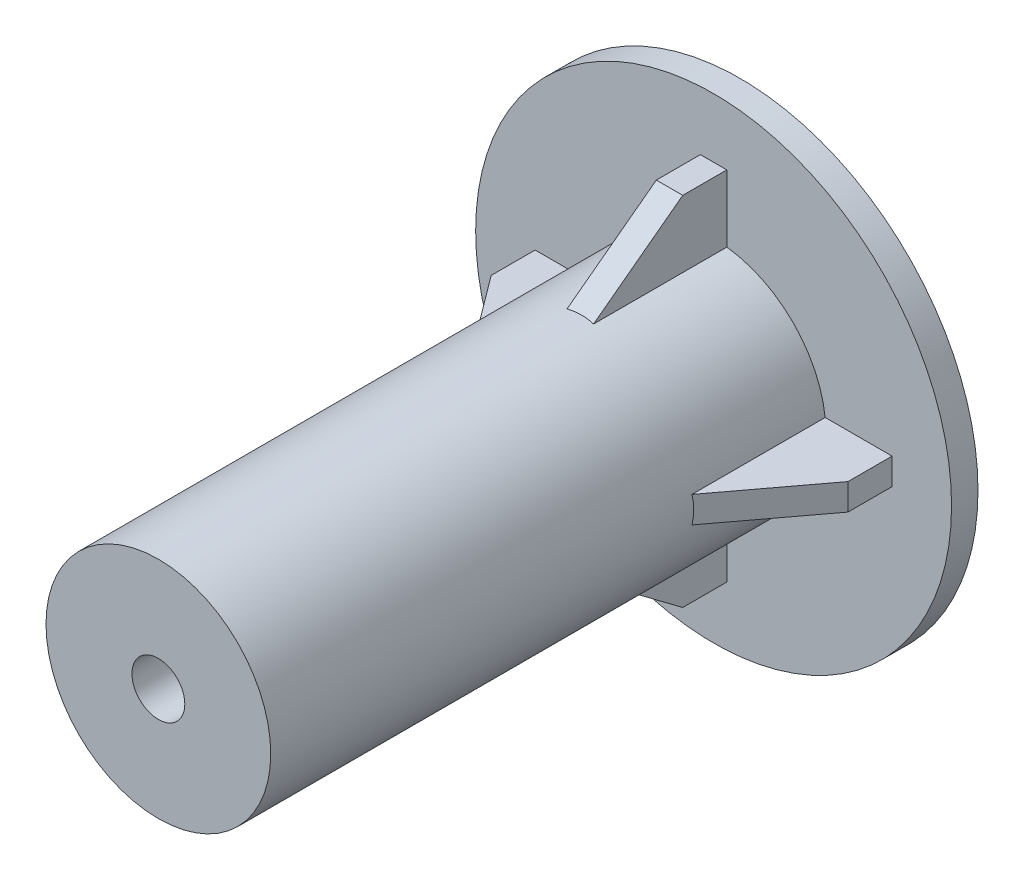
ISO-10303-21;
HEADER;
FILE_DESCRIPTION(('STEP AP214'),'2;1');
FILE_NAME('part.step','',(''),(''),'','','');
FILE_SCHEMA(('AUTOMOTIVE_DESIGN { 1 0 10303 214 1 1 1 1 }'));
ENDSEC;
DATA;
#1=APPLICATION_CONTEXT('core data for automotive mechanical design processes');
#2=APPLICATION_PROTOCOL_DEFINITION('international standard','automotive_design',2000,#1);
#3=PRODUCT_CONTEXT('',#1,'mechanical');
#4=PRODUCT('Part','Part','',(#3));
#5=PRODUCT_RELATED_PRODUCT_CATEGORY('part','',(#4));
#6=PRODUCT_DEFINITION_FORMATION('','',#4);
#7=PRODUCT_DEFINITION_CONTEXT('part definition',#1,'design');
#8=PRODUCT_DEFINITION('design','',#6,#7);
#9=PRODUCT_DEFINITION_SHAPE('','',#8);
#10=(LENGTH_UNIT() NAMED_UNIT(*) SI_UNIT(.MILLI.,.METRE.));
#11=(NAMED_UNIT(*) PLANE_ANGLE_UNIT() SI_UNIT($,.RADIAN.));
#12=(NAMED_UNIT(*) SI_UNIT($,.STERADIAN.) SOLID_ANGLE_UNIT());
#13=UNCERTAINTY_MEASURE_WITH_UNIT(LENGTH_MEASURE(1.E-05),#10,'distance_accuracy_value','');
#14=(GEOMETRIC_REPRESENTATION_CONTEXT(3) GLOBAL_UNCERTAINTY_ASSIGNED_CONTEXT((#13)) GLOBAL_UNIT_ASSIGNED_CONTEXT((#10,
#11,#12)) REPRESENTATION_CONTEXT('',''));
#15=CARTESIAN_POINT('',(0.,0.,0.));
#16=DIRECTION('',(0.,0.,1.));
#17=DIRECTION('',(1.,0.,0.));
#18=AXIS2_PLACEMENT_3D('',#15,#16,#17);
#19=CARTESIAN_POINT('',(0.,0.,210.));
#20=DIRECTION('',(0.,0.,-1.));
#21=DIRECTION('',(-1.,0.,0.));
#22=AXIS2_PLACEMENT_3D('',#19,#20,#21);
#23=CYLINDRICAL_SURFACE('',#22,42.5);
#24=CARTESIAN_POINT('',(0.,0.,106.666666666667));
#25=DIRECTION('',(0.,-0.8,-0.6));
#26=DIRECTION('',(0.,0.6,-0.8));
#27=AXIS2_PLACEMENT_3D('',#24,#25,#26);
#28=ELLIPSE('',#27,70.8333333333334,42.5);
#29=CARTESIAN_POINT('',(5.00000000000015,42.2048575403353,50.3935232795529));
#30=VERTEX_POINT('',#29);
#31=CARTESIAN_POINT('',(-4.99999999999985,42.2048575403354,50.3935232795529));
#32=VERTEX_POINT('',#31);
#33=EDGE_CURVE('E216',#30,#32,#28,.F.);
#34=ORIENTED_EDGE('',*,*,#33,.T.);
#35=DIRECTION('',(0.,0.,-1.));
#36=VECTOR('',#35,1.);
#37=CARTESIAN_POINT('',(-4.99999999999985,42.2048575403354,210.));
#38=LINE('',#37,#36);
#39=CARTESIAN_POINT('',(-4.99999999999985,42.2048575403354,0.));
#40=VERTEX_POINT('',#39);
#41=EDGE_CURVE('E209',#40,#32,#38,.F.);
#42=ORIENTED_EDGE('',*,*,#41,.F.);
#43=CARTESIAN_POINT('',(0.,0.,0.));
#44=DIRECTION('',(0.,0.,-1.));
#45=DIRECTION('',(-1.,0.,0.));
#46=AXIS2_PLACEMENT_3D('',#43,#44,#45);
#47=CIRCLE('',#46,42.5);
#48=CARTESIAN_POINT('',(-42.2048575403353,5.,0.));
#49=VERTEX_POINT('',#48);
#50=EDGE_CURVE('E238',#49,#40,#47,.T.);
#51=ORIENTED_EDGE('',*,*,#50,.F.);
#52=DIRECTION('',(0.,0.,-1.));
#53=VECTOR('',#52,1.);
#54=CARTESIAN_POINT('',(-42.2048575403353,5.,210.));
#55=LINE('',#54,#53);
#56=CARTESIAN_POINT('',(-42.2048575403353,5.,50.3935232795529));
#57=VERTEX_POINT('',#56);
#58=EDGE_CURVE('E227',#49,#57,#55,.F.);
#59=ORIENTED_EDGE('',*,*,#58,.T.);
#60=CARTESIAN_POINT('',(0.,0.,106.666666666667));
#61=DIRECTION('',(0.8,0.,-0.6));
#62=DIRECTION('',(-0.6,0.,-0.8));
#63=AXIS2_PLACEMENT_3D('',#60,#61,#62);
#64=ELLIPSE('',#63,70.8333333333334,42.5);
#65=CARTESIAN_POINT('',(-42.2048575403353,-5.,50.3935232795529));
#66=VERTEX_POINT('',#65);
#67=EDGE_CURVE('E229',#57,#66,#64,.F.);
#68=ORIENTED_EDGE('',*,*,#67,.T.);
#69=DIRECTION('',(0.,0.,-1.));
#70=VECTOR('',#69,1.);
#71=CARTESIAN_POINT('',(-42.2048575403353,-5.,210.));
#72=LINE('',#71,#70);
#73=CARTESIAN_POINT('',(-42.2048575403353,-5.,0.));
#74=VERTEX_POINT('',#73);
#75=EDGE_CURVE('E222',#74,#66,#72,.F.);
#76=ORIENTED_EDGE('',*,*,#75,.F.);
#77=CARTESIAN_POINT('',(-5.00000000000044,-42.2048575403353,0.));
#78=VERTEX_POINT('',#77);
#79=EDGE_CURVE('E235',#78,#74,#47,.T.);
#80=ORIENTED_EDGE('',*,*,#79,.F.);
#81=DIRECTION('',(0.,0.,-1.));
#82=VECTOR('',#81,1.);
#83=CARTESIAN_POINT('',(-5.00000000000044,-42.2048575403353,210.));
#84=LINE('',#83,#82);
#85=CARTESIAN_POINT('',(-5.00000000000044,-42.2048575403353,50.3935232795529));
#86=VERTEX_POINT('',#85);
#87=EDGE_CURVE('E174',#78,#86,#84,.F.);
#88=ORIENTED_EDGE('',*,*,#87,.T.);
#89=CARTESIAN_POINT('',(0.,0.,106.666666666667));
#90=DIRECTION('',(0.,0.8,-0.6));
#91=DIRECTION('',(0.,-0.6,-0.8));
#92=AXIS2_PLACEMENT_3D('',#89,#90,#91);
#93=ELLIPSE('',#92,70.8333333333334,42.5);
#94=CARTESIAN_POINT('',(4.99999999999956,-42.2048575403354,50.3935232795529));
#95=VERTEX_POINT('',#94);
#96=EDGE_CURVE('E186',#86,#95,#93,.F.);
#97=ORIENTED_EDGE('',*,*,#96,.T.);
#98=DIRECTION('',(0.,0.,-1.));
#99=VECTOR('',#98,1.);
#100=CARTESIAN_POINT('',(4.99999999999956,-42.2048575403354,210.));
#101=LINE('',#100,#99);
#102=CARTESIAN_POINT('',(4.99999999999956,-42.2048575403354,0.));
#103=VERTEX_POINT('',#102);
#104=EDGE_CURVE('E183',#103,#95,#101,.F.);
#105=ORIENTED_EDGE('',*,*,#104,.F.);
#106=CARTESIAN_POINT('',(42.2048575403353,-5.,0.));
#107=VERTEX_POINT('',#106);
#108=EDGE_CURVE('E324',#107,#103,#47,.T.);
#109=ORIENTED_EDGE('',*,*,#108,.F.);
#110=DIRECTION('',(0.,0.,-1.));
#111=VECTOR('',#110,1.);
#112=CARTESIAN_POINT('',(42.2048575403353,-5.,210.));
#113=LINE('',#112,#111);
#114=CARTESIAN_POINT('',(42.2048575403353,-5.,50.3935232795529));
#115=VERTEX_POINT('',#114);
#116=EDGE_CURVE('E196',#107,#115,#113,.F.);
#117=ORIENTED_EDGE('',*,*,#116,.T.);
#118=CARTESIAN_POINT('',(0.,0.,106.666666666667));
#119=DIRECTION('',(-0.8,0.,-0.6));
#120=DIRECTION('',(0.6,0.,-0.8));
#121=AXIS2_PLACEMENT_3D('',#118,#119,#120);
#122=ELLIPSE('',#121,70.8333333333334,42.5);
#123=CARTESIAN_POINT('',(42.2048575403353,5.,50.3935232795529));
#124=VERTEX_POINT('',#123);
#125=EDGE_CURVE('E203',#115,#124,#122,.F.);
#126=ORIENTED_EDGE('',*,*,#125,.T.);
#127=DIRECTION('',(0.,0.,-1.));
#128=VECTOR('',#127,1.);
#129=CARTESIAN_POINT('',(42.2048575403353,5.,210.));
#130=LINE('',#129,#128);
#131=CARTESIAN_POINT('',(42.2048575403353,5.,0.));
#132=VERTEX_POINT('',#131);
#133=EDGE_CURVE('E200',#132,#124,#130,.F.);
#134=ORIENTED_EDGE('',*,*,#133,.F.);
#135=CARTESIAN_POINT('',(5.00000000000015,42.2048575403353,0.));
#136=VERTEX_POINT('',#135);
#137=EDGE_CURVE('E242',#136,#132,#47,.T.);
#138=ORIENTED_EDGE('',*,*,#137,.F.);
#139=DIRECTION('',(0.,0.,-1.));
#140=VECTOR('',#139,1.);
#141=CARTESIAN_POINT('',(5.00000000000015,42.2048575403353,210.));
#142=LINE('',#141,#140);
#143=EDGE_CURVE('E214',#136,#30,#142,.F.);
#144=ORIENTED_EDGE('',*,*,#143,.T.);
#145=EDGE_LOOP('',(#34,#42,#51,#59,#68,#76,#80,#88,#97,#105,#109,#117,#126,#134,#138,#144));
#146=FACE_BOUND('',#145,.T.);
#147=CARTESIAN_POINT('',(0.,0.,210.));
#148=DIRECTION('',(0.,0.,1.));
#149=DIRECTION('',(1.,0.,0.));
#150=AXIS2_PLACEMENT_3D('',#147,#148,#149);
#151=CIRCLE('',#150,42.5);
#152=CARTESIAN_POINT('',(42.5,0.,210.));
#153=VERTEX_POINT('',#152);
#154=EDGE_CURVE('E246',#153,#153,#151,.T.);
#155=ORIENTED_EDGE('',*,*,#154,.F.);
#156=EDGE_LOOP('',(#155));
#157=FACE_BOUND('',#156,.T.);
#158=ADVANCED_FACE('F37',(#146,#157),#23,.T.);
#159=CARTESIAN_POINT('',(0.,0.,210.));
#160=DIRECTION('',(0.,0.,1.));
#161=DIRECTION('',(1.,0.,0.));
#162=AXIS2_PLACEMENT_3D('',#159,#160,#161);
#163=PLANE('',#162);
#164=CARTESIAN_POINT('',(0.,0.,210.));
#165=DIRECTION('',(0.,0.,1.));
#166=DIRECTION('',(1.,0.,0.));
#167=AXIS2_PLACEMENT_3D('',#164,#165,#166);
#168=CIRCLE('',#167,10.);
#169=CARTESIAN_POINT('',(10.,0.,210.));
#170=VERTEX_POINT('',#169);
#171=EDGE_CURVE('E241',#170,#170,#168,.T.);
#172=ORIENTED_EDGE('',*,*,#171,.F.);
#173=EDGE_LOOP('',(#172));
#174=FACE_BOUND('',#173,.T.);
#175=ORIENTED_EDGE('',*,*,#154,.T.);
#176=EDGE_LOOP('',(#175));
#177=FACE_BOUND('',#176,.T.);
#178=ADVANCED_FACE('F348',(#174,#177),#163,.T.);
#179=CARTESIAN_POINT('',(0.,0.,190.));
#180=DIRECTION('',(0.,0.,1.));
#181=DIRECTION('',(1.,0.,0.));
#182=AXIS2_PLACEMENT_3D('',#179,#180,#181);
#183=CYLINDRICAL_SURFACE('',#182,10.);
#184=CARTESIAN_POINT('',(0.,0.,190.));
#185=DIRECTION('',(0.,0.,1.));
#186=DIRECTION('',(1.,0.,0.));
#187=AXIS2_PLACEMENT_3D('',#184,#185,#186);
#188=CIRCLE('',#187,10.);
#189=CARTESIAN_POINT('',(10.,0.,190.));
#190=VERTEX_POINT('',#189);
#191=EDGE_CURVE('E243',#190,#190,#188,.T.);
#192=ORIENTED_EDGE('',*,*,#191,.F.);
#193=EDGE_LOOP('',(#192));
#194=FACE_BOUND('',#193,.T.);
#195=ORIENTED_EDGE('',*,*,#171,.T.);
#196=EDGE_LOOP('',(#195));
#197=FACE_BOUND('',#196,.T.);
#198=ADVANCED_FACE('F352',(#194,#197),#183,.F.);
#199=CARTESIAN_POINT('',(0.,0.,190.));
#200=DIRECTION('',(0.,0.,1.));
#201=DIRECTION('',(1.,0.,0.));
#202=AXIS2_PLACEMENT_3D('',#199,#200,#201);
#203=PLANE('',#202);
#204=ORIENTED_EDGE('',*,*,#191,.T.);
#205=EDGE_LOOP('',(#204));
#206=FACE_BOUND('',#205,.T.);
#207=ADVANCED_FACE('F357',(#206),#203,.T.);
#208=CARTESIAN_POINT('',(0.,0.,-10.));
#209=DIRECTION('',(0.,0.,1.));
#210=DIRECTION('',(1.,0.,0.));
#211=AXIS2_PLACEMENT_3D('',#208,#209,#210);
#212=CYLINDRICAL_SURFACE('',#211,90.);
#213=CARTESIAN_POINT('',(0.,0.,-10.));
#214=DIRECTION('',(0.,0.,-1.));
#215=DIRECTION('',(-1.,0.,0.));
#216=AXIS2_PLACEMENT_3D('',#213,#214,#215);
#217=CIRCLE('',#216,90.);
#218=CARTESIAN_POINT('',(-90.,0.,-10.));
#219=VERTEX_POINT('',#218);
#220=EDGE_CURVE('E232',#219,#219,#217,.T.);
#221=ORIENTED_EDGE('',*,*,#220,.F.);
#222=EDGE_LOOP('',(#221));
#223=FACE_BOUND('',#222,.T.);
#224=CARTESIAN_POINT('',(0.,0.,0.));
#225=DIRECTION('',(0.,0.,-1.));
#226=DIRECTION('',(-1.,0.,0.));
#227=AXIS2_PLACEMENT_3D('',#224,#225,#226);
#228=CIRCLE('',#227,90.);
#229=CARTESIAN_POINT('',(-90.,0.,0.));
#230=VERTEX_POINT('',#229);
#231=EDGE_CURVE('E231',#230,#230,#228,.T.);
#232=ORIENTED_EDGE('',*,*,#231,.T.);
#233=EDGE_LOOP('',(#232));
#234=FACE_BOUND('',#233,.T.);
#235=ADVANCED_FACE('F365',(#223,#234),#212,.T.);
#236=CARTESIAN_POINT('',(0.,0.,-10.));
#237=DIRECTION('',(0.,0.,-1.));
#238=DIRECTION('',(-1.,0.,0.));
#239=AXIS2_PLACEMENT_3D('',#236,#237,#238);
#240=PLANE('',#239);
#241=ORIENTED_EDGE('',*,*,#220,.T.);
#242=EDGE_LOOP('',(#241));
#243=FACE_BOUND('',#242,.T.);
#244=ADVANCED_FACE('F369',(#243),#240,.T.);
#245=CARTESIAN_POINT('',(0.,0.,0.));
#246=DIRECTION('',(0.,0.,-1.));
#247=DIRECTION('',(-1.,0.,0.));
#248=AXIS2_PLACEMENT_3D('',#245,#246,#247);
#249=PLANE('',#248);
#250=DIRECTION('',(0.,-1.,0.));
#251=VECTOR('',#250,1.);
#252=CARTESIAN_POINT('',(-67.5,67.5,0.));
#253=LINE('',#252,#251);
#254=CARTESIAN_POINT('',(-67.5,5.,0.));
#255=VERTEX_POINT('',#254);
#256=CARTESIAN_POINT('',(-67.5,-5.,0.));
#257=VERTEX_POINT('',#256);
#258=EDGE_CURVE('E51',#255,#257,#253,.T.);
#259=ORIENTED_EDGE('',*,*,#258,.F.);
#260=DIRECTION('',(1.,0.,0.));
#261=VECTOR('',#260,1.);
#262=CARTESIAN_POINT('',(0.,5.,0.));
#263=LINE('',#262,#261);
#264=EDGE_CURVE('E253',#255,#49,#263,.T.);
#265=ORIENTED_EDGE('',*,*,#264,.T.);
#266=ORIENTED_EDGE('',*,*,#50,.T.);
#267=DIRECTION('',(0.,-1.,0.));
#268=VECTOR('',#267,1.);
#269=CARTESIAN_POINT('',(-5.,0.,0.));
#270=LINE('',#269,#268);
#271=CARTESIAN_POINT('',(-4.99999999999976,67.5,0.));
#272=VERTEX_POINT('',#271);
#273=EDGE_CURVE('E255',#272,#40,#270,.T.);
#274=ORIENTED_EDGE('',*,*,#273,.F.);
#275=DIRECTION('',(-1.,0.,0.));
#276=VECTOR('',#275,1.);
#277=CARTESIAN_POINT('',(67.5,67.5,0.));
#278=LINE('',#277,#276);
#279=CARTESIAN_POINT('',(5.00000000000023,67.5,0.));
#280=VERTEX_POINT('',#279);
#281=EDGE_CURVE('E58',#280,#272,#278,.T.);
#282=ORIENTED_EDGE('',*,*,#281,.F.);
#283=DIRECTION('',(0.,-1.,0.));
#284=VECTOR('',#283,1.);
#285=CARTESIAN_POINT('',(5.,0.,0.));
#286=LINE('',#285,#284);
#287=EDGE_CURVE('E159',#280,#136,#286,.T.);
#288=ORIENTED_EDGE('',*,*,#287,.T.);
#289=ORIENTED_EDGE('',*,*,#137,.T.);
#290=DIRECTION('',(-1.,0.,0.));
#291=VECTOR('',#290,1.);
#292=CARTESIAN_POINT('',(0.,5.,0.));
#293=LINE('',#292,#291);
#294=CARTESIAN_POINT('',(67.5,5.,0.));
#295=VERTEX_POINT('',#294);
#296=EDGE_CURVE('E198',#295,#132,#293,.T.);
#297=ORIENTED_EDGE('',*,*,#296,.F.);
#298=DIRECTION('',(0.,1.,0.));
#299=VECTOR('',#298,1.);
#300=CARTESIAN_POINT('',(67.5,67.5,0.));
#301=LINE('',#300,#299);
#302=CARTESIAN_POINT('',(67.5,-5.,0.));
#303=VERTEX_POINT('',#302);
#304=EDGE_CURVE('E170',#303,#295,#301,.T.);
#305=ORIENTED_EDGE('',*,*,#304,.F.);
#306=DIRECTION('',(-1.,0.,0.));
#307=VECTOR('',#306,1.);
#308=CARTESIAN_POINT('',(0.,-5.,0.));
#309=LINE('',#308,#307);
#310=EDGE_CURVE('E192',#303,#107,#309,.T.);
#311=ORIENTED_EDGE('',*,*,#310,.T.);
#312=ORIENTED_EDGE('',*,*,#108,.T.);
#313=DIRECTION('',(0.,1.,0.));
#314=VECTOR('',#313,1.);
#315=CARTESIAN_POINT('',(5.,0.,0.));
#316=LINE('',#315,#314);
#317=CARTESIAN_POINT('',(4.9999999999993,-67.5,0.));
#318=VERTEX_POINT('',#317);
#319=EDGE_CURVE('E169',#318,#103,#316,.T.);
#320=ORIENTED_EDGE('',*,*,#319,.F.);
#321=DIRECTION('',(1.,0.,0.));
#322=VECTOR('',#321,1.);
#323=CARTESIAN_POINT('',(67.5,-67.5,0.));
#324=LINE('',#323,#322);
#325=CARTESIAN_POINT('',(-5.00000000000071,-67.5,0.));
#326=VERTEX_POINT('',#325);
#327=EDGE_CURVE('E150',#326,#318,#324,.T.);
#328=ORIENTED_EDGE('',*,*,#327,.F.);
#329=DIRECTION('',(0.,1.,0.));
#330=VECTOR('',#329,1.);
#331=CARTESIAN_POINT('',(-5.,0.,0.));
#332=LINE('',#331,#330);
#333=EDGE_CURVE('E166',#326,#78,#332,.T.);
#334=ORIENTED_EDGE('',*,*,#333,.T.);
#335=ORIENTED_EDGE('',*,*,#79,.T.);
#336=DIRECTION('',(1.,0.,0.));
#337=VECTOR('',#336,1.);
#338=CARTESIAN_POINT('',(0.,-5.,0.));
#339=LINE('',#338,#337);
#340=EDGE_CURVE('E251',#257,#74,#339,.T.);
#341=ORIENTED_EDGE('',*,*,#340,.F.);
#342=EDGE_LOOP('',(#259,#265,#266,#274,#282,#288,#289,#297,#305,#311,#312,#320,#328,#334,#335,#341));
#343=FACE_BOUND('',#342,.T.);
#344=ORIENTED_EDGE('',*,*,#231,.F.);
#345=EDGE_LOOP('',(#344));
#346=FACE_BOUND('',#345,.T.);
#347=ADVANCED_FACE('F163',(#343,#346),#249,.F.);
#348=CARTESIAN_POINT('',(-42.5,0.,50.));
#349=DIRECTION('',(0.8,0.,-0.6));
#350=DIRECTION('',(-0.6,0.,-0.8));
#351=AXIS2_PLACEMENT_3D('',#348,#349,#350);
#352=PLANE('',#351);
#353=DIRECTION('',(0.,-1.,0.));
#354=VECTOR('',#353,1.);
#355=CARTESIAN_POINT('',(-67.5,0.,16.6666666666667));
#356=LINE('',#355,#354);
#357=CARTESIAN_POINT('',(-67.5,-5.,16.6666666666667));
#358=VERTEX_POINT('',#357);
#359=CARTESIAN_POINT('',(-67.5,5.,16.6666666666667));
#360=VERTEX_POINT('',#359);
#361=EDGE_CURVE('E279',#358,#360,#356,.F.);
#362=ORIENTED_EDGE('',*,*,#361,.F.);
#363=DIRECTION('',(-0.6,0.,-0.8));
#364=VECTOR('',#363,1.);
#365=CARTESIAN_POINT('',(-42.5,-5.,50.));
#366=LINE('',#365,#364);
#367=EDGE_CURVE('E218',#66,#358,#366,.T.);
#368=ORIENTED_EDGE('',*,*,#367,.F.);
#369=ORIENTED_EDGE('',*,*,#67,.F.);
#370=DIRECTION('',(-0.6,0.,-0.8));
#371=VECTOR('',#370,1.);
#372=CARTESIAN_POINT('',(-42.5,5.,50.));
#373=LINE('',#372,#371);
#374=EDGE_CURVE('E219',#57,#360,#373,.T.);
#375=ORIENTED_EDGE('',*,*,#374,.T.);
#376=EDGE_LOOP('',(#362,#368,#369,#375));
#377=FACE_BOUND('',#376,.T.);
#378=ADVANCED_FACE('F333',(#377),#352,.F.);
#379=CARTESIAN_POINT('',(0.,5.,100.));
#380=DIRECTION('',(0.,1.,0.));
#381=DIRECTION('',(0.,0.,1.));
#382=AXIS2_PLACEMENT_3D('',#379,#380,#381);
#383=PLANE('',#382);
#384=DIRECTION('',(0.,0.,-1.));
#385=VECTOR('',#384,1.);
#386=CARTESIAN_POINT('',(-67.5,5.,100.));
#387=LINE('',#386,#385);
#388=EDGE_CURVE('E287',#360,#255,#387,.T.);
#389=ORIENTED_EDGE('',*,*,#388,.F.);
#390=ORIENTED_EDGE('',*,*,#374,.F.);
#391=ORIENTED_EDGE('',*,*,#58,.F.);
#392=ORIENTED_EDGE('',*,*,#264,.F.);
#393=EDGE_LOOP('',(#389,#390,#391,#392));
#394=FACE_BOUND('',#393,.T.);
#395=ADVANCED_FACE('F337',(#394),#383,.T.);
#396=CARTESIAN_POINT('',(0.,-5.,100.));
#397=DIRECTION('',(0.,1.,0.));
#398=DIRECTION('',(0.,0.,1.));
#399=AXIS2_PLACEMENT_3D('',#396,#397,#398);
#400=PLANE('',#399);
#401=ORIENTED_EDGE('',*,*,#367,.T.);
#402=DIRECTION('',(0.,0.,-1.));
#403=VECTOR('',#402,1.);
#404=CARTESIAN_POINT('',(-67.5,-5.,100.));
#405=LINE('',#404,#403);
#406=EDGE_CURVE('E12',#358,#257,#405,.T.);
#407=ORIENTED_EDGE('',*,*,#406,.T.);
#408=ORIENTED_EDGE('',*,*,#340,.T.);
#409=ORIENTED_EDGE('',*,*,#75,.T.);
#410=EDGE_LOOP('',(#401,#407,#408,#409));
#411=FACE_BOUND('',#410,.T.);
#412=ADVANCED_FACE('F330',(#411),#400,.F.);
#413=CARTESIAN_POINT('',(1.48387956900833E-13,42.5,50.));
#414=DIRECTION('',(0.,-0.8,-0.6));
#415=DIRECTION('',(0.,0.6,-0.8));
#416=AXIS2_PLACEMENT_3D('',#413,#414,#415);
#417=PLANE('',#416);
#418=DIRECTION('',(-1.,0.,0.));
#419=VECTOR('',#418,1.);
#420=CARTESIAN_POINT('',(0.,67.5,16.6666666666667));
#421=LINE('',#420,#419);
#422=CARTESIAN_POINT('',(-4.99999999999976,67.5,16.6666666666667));
#423=VERTEX_POINT('',#422);
#424=CARTESIAN_POINT('',(5.00000000000036,67.5,16.6666666666667));
#425=VERTEX_POINT('',#424);
#426=EDGE_CURVE('E274',#423,#425,#421,.F.);
#427=ORIENTED_EDGE('',*,*,#426,.F.);
#428=DIRECTION('',(0.,0.6,-0.8));
#429=VECTOR('',#428,1.);
#430=CARTESIAN_POINT('',(-4.99999999999985,42.5,50.));
#431=LINE('',#430,#429);
#432=EDGE_CURVE('E205',#32,#423,#431,.T.);
#433=ORIENTED_EDGE('',*,*,#432,.F.);
#434=ORIENTED_EDGE('',*,*,#33,.F.);
#435=DIRECTION('',(0.,0.6,-0.8));
#436=VECTOR('',#435,1.);
#437=CARTESIAN_POINT('',(5.00000000000015,42.5,50.));
#438=LINE('',#437,#436);
#439=EDGE_CURVE('E206',#30,#425,#438,.T.);
#440=ORIENTED_EDGE('',*,*,#439,.T.);
#441=EDGE_LOOP('',(#427,#433,#434,#440));
#442=FACE_BOUND('',#441,.T.);
#443=ADVANCED_FACE('F272',(#442),#417,.F.);
#444=CARTESIAN_POINT('',(5.,0.,100.));
#445=DIRECTION('',(1.,0.,0.));
#446=DIRECTION('',(0.,1.,0.));
#447=AXIS2_PLACEMENT_3D('',#444,#445,#446);
#448=PLANE('',#447);
#449=DIRECTION('',(0.,0.,-1.));
#450=VECTOR('',#449,1.);
#451=CARTESIAN_POINT('',(5.00000000000024,67.5,100.));
#452=LINE('',#451,#450);
#453=EDGE_CURVE('E276',#425,#280,#452,.T.);
#454=ORIENTED_EDGE('',*,*,#453,.F.);
#455=ORIENTED_EDGE('',*,*,#439,.F.);
#456=ORIENTED_EDGE('',*,*,#143,.F.);
#457=ORIENTED_EDGE('',*,*,#287,.F.);
#458=EDGE_LOOP('',(#454,#455,#456,#457));
#459=FACE_BOUND('',#458,.T.);
#460=ADVANCED_FACE('F411',(#459),#448,.T.);
#461=CARTESIAN_POINT('',(-5.,0.,100.));
#462=DIRECTION('',(1.,0.,0.));
#463=DIRECTION('',(0.,1.,0.));
#464=AXIS2_PLACEMENT_3D('',#461,#462,#463);
#465=PLANE('',#464);
#466=ORIENTED_EDGE('',*,*,#432,.T.);
#467=DIRECTION('',(0.,0.,-1.));
#468=VECTOR('',#467,1.);
#469=CARTESIAN_POINT('',(-4.99999999999976,67.5,100.));
#470=LINE('',#469,#468);
#471=EDGE_CURVE('E44',#423,#272,#470,.T.);
#472=ORIENTED_EDGE('',*,*,#471,.T.);
#473=ORIENTED_EDGE('',*,*,#273,.T.);
#474=ORIENTED_EDGE('',*,*,#41,.T.);
#475=EDGE_LOOP('',(#466,#472,#473,#474));
#476=FACE_BOUND('',#475,.T.);
#477=ADVANCED_FACE('F260',(#476),#465,.F.);
#478=CARTESIAN_POINT('',(42.5,0.,50.));
#479=DIRECTION('',(-0.8,0.,-0.6));
#480=DIRECTION('',(0.6,0.,-0.8));
#481=AXIS2_PLACEMENT_3D('',#478,#479,#480);
#482=PLANE('',#481);
#483=DIRECTION('',(0.,1.,0.));
#484=VECTOR('',#483,1.);
#485=CARTESIAN_POINT('',(67.5,0.,16.6666666666667));
#486=LINE('',#485,#484);
#487=CARTESIAN_POINT('',(67.5,5.,16.6666666666667));
#488=VERTEX_POINT('',#487);
#489=CARTESIAN_POINT('',(67.5,-5.,16.6666666666667));
#490=VERTEX_POINT('',#489);
#491=EDGE_CURVE('E282',#488,#490,#486,.F.);
#492=ORIENTED_EDGE('',*,*,#491,.F.);
#493=DIRECTION('',(0.6,0.,-0.8));
#494=VECTOR('',#493,1.);
#495=CARTESIAN_POINT('',(42.5,5.,50.));
#496=LINE('',#495,#494);
#497=EDGE_CURVE('E188',#124,#488,#496,.T.);
#498=ORIENTED_EDGE('',*,*,#497,.F.);
#499=ORIENTED_EDGE('',*,*,#125,.F.);
#500=DIRECTION('',(0.6,0.,-0.8));
#501=VECTOR('',#500,1.);
#502=CARTESIAN_POINT('',(42.5,-5.,50.));
#503=LINE('',#502,#501);
#504=EDGE_CURVE('E189',#115,#490,#503,.T.);
#505=ORIENTED_EDGE('',*,*,#504,.T.);
#506=EDGE_LOOP('',(#492,#498,#499,#505));
#507=FACE_BOUND('',#506,.T.);
#508=ADVANCED_FACE('F315',(#507),#482,.F.);
#509=CARTESIAN_POINT('',(0.,5.,100.));
#510=DIRECTION('',(0.,-1.,0.));
#511=DIRECTION('',(0.,0.,-1.));
#512=AXIS2_PLACEMENT_3D('',#509,#510,#511);
#513=PLANE('',#512);
#514=ORIENTED_EDGE('',*,*,#497,.T.);
#515=DIRECTION('',(0.,0.,-1.));
#516=VECTOR('',#515,1.);
#517=CARTESIAN_POINT('',(67.5,5.,100.));
#518=LINE('',#517,#516);
#519=EDGE_CURVE('E277',#488,#295,#518,.T.);
#520=ORIENTED_EDGE('',*,*,#519,.T.);
#521=ORIENTED_EDGE('',*,*,#296,.T.);
#522=ORIENTED_EDGE('',*,*,#133,.T.);
#523=EDGE_LOOP('',(#514,#520,#521,#522));
#524=FACE_BOUND('',#523,.T.);
#525=ADVANCED_FACE('F320',(#524),#513,.F.);
#526=CARTESIAN_POINT('',(0.,-5.,100.));
#527=DIRECTION('',(0.,-1.,0.));
#528=DIRECTION('',(0.,0.,-1.));
#529=AXIS2_PLACEMENT_3D('',#526,#527,#528);
#530=PLANE('',#529);
#531=DIRECTION('',(0.,0.,-1.));
#532=VECTOR('',#531,1.);
#533=CARTESIAN_POINT('',(67.5,-5.,100.));
#534=LINE('',#533,#532);
#535=EDGE_CURVE('E158',#490,#303,#534,.T.);
#536=ORIENTED_EDGE('',*,*,#535,.F.);
#537=ORIENTED_EDGE('',*,*,#504,.F.);
#538=ORIENTED_EDGE('',*,*,#116,.F.);
#539=ORIENTED_EDGE('',*,*,#310,.F.);
#540=EDGE_LOOP('',(#536,#537,#538,#539));
#541=FACE_BOUND('',#540,.T.);
#542=ADVANCED_FACE('F312',(#541),#530,.T.);
#543=CARTESIAN_POINT('',(-4.451638707025E-13,-42.5,50.));
#544=DIRECTION('',(0.,0.8,-0.6));
#545=DIRECTION('',(0.,-0.6,-0.8));
#546=AXIS2_PLACEMENT_3D('',#543,#544,#545);
#547=PLANE('',#546);
#548=DIRECTION('',(1.,0.,0.));
#549=VECTOR('',#548,1.);
#550=CARTESIAN_POINT('',(0.,-67.5,16.6666666666667));
#551=LINE('',#550,#549);
#552=CARTESIAN_POINT('',(4.99999999999956,-67.5,16.6666666666667));
#553=VERTEX_POINT('',#552);
#554=CARTESIAN_POINT('',(-5.00000000000071,-67.5,16.6666666666666));
#555=VERTEX_POINT('',#554);
#556=EDGE_CURVE('E153',#553,#555,#551,.F.);
#557=ORIENTED_EDGE('',*,*,#556,.F.);
#558=DIRECTION('',(0.,-0.6,-0.8));
#559=VECTOR('',#558,1.);
#560=CARTESIAN_POINT('',(4.99999999999956,-42.5000000000001,50.));
#561=LINE('',#560,#559);
#562=EDGE_CURVE('E178',#95,#553,#561,.T.);
#563=ORIENTED_EDGE('',*,*,#562,.F.);
#564=ORIENTED_EDGE('',*,*,#96,.F.);
#565=DIRECTION('',(0.,-0.6,-0.8));
#566=VECTOR('',#565,1.);
#567=CARTESIAN_POINT('',(-5.00000000000044,-42.5,50.));
#568=LINE('',#567,#566);
#569=EDGE_CURVE('E175',#86,#555,#568,.T.);
#570=ORIENTED_EDGE('',*,*,#569,.T.);
#571=EDGE_LOOP('',(#557,#563,#564,#570));
#572=FACE_BOUND('',#571,.T.);
#573=ADVANCED_FACE('F297',(#572),#547,.F.);
#574=CARTESIAN_POINT('',(5.,0.,100.));
#575=DIRECTION('',(-1.,0.,0.));
#576=DIRECTION('',(0.,-1.,0.));
#577=AXIS2_PLACEMENT_3D('',#574,#575,#576);
#578=PLANE('',#577);
#579=ORIENTED_EDGE('',*,*,#562,.T.);
#580=DIRECTION('',(0.,0.,-1.));
#581=VECTOR('',#580,1.);
#582=CARTESIAN_POINT('',(4.99999999999929,-67.5,100.));
#583=LINE('',#582,#581);
#584=EDGE_CURVE('E293',#553,#318,#583,.T.);
#585=ORIENTED_EDGE('',*,*,#584,.T.);
#586=ORIENTED_EDGE('',*,*,#319,.T.);
#587=ORIENTED_EDGE('',*,*,#104,.T.);
#588=EDGE_LOOP('',(#579,#585,#586,#587));
#589=FACE_BOUND('',#588,.T.);
#590=ADVANCED_FACE('F292',(#589),#578,.F.);
#591=CARTESIAN_POINT('',(-5.,0.,100.));
#592=DIRECTION('',(-1.,0.,0.));
#593=DIRECTION('',(0.,-1.,0.));
#594=AXIS2_PLACEMENT_3D('',#591,#592,#593);
#595=PLANE('',#594);
#596=DIRECTION('',(0.,0.,-1.));
#597=VECTOR('',#596,1.);
#598=CARTESIAN_POINT('',(-5.00000000000071,-67.5,100.));
#599=LINE('',#598,#597);
#600=EDGE_CURVE('E147',#555,#326,#599,.T.);
#601=ORIENTED_EDGE('',*,*,#600,.F.);
#602=ORIENTED_EDGE('',*,*,#569,.F.);
#603=ORIENTED_EDGE('',*,*,#87,.F.);
#604=ORIENTED_EDGE('',*,*,#333,.F.);
#605=EDGE_LOOP('',(#601,#602,#603,#604));
#606=FACE_BOUND('',#605,.T.);
#607=ADVANCED_FACE('F173',(#606),#595,.T.);
#608=CARTESIAN_POINT('',(67.5,-67.5,94.));
#609=DIRECTION('',(0.,1.,0.));
#610=DIRECTION('',(-1.,0.,0.));
#611=AXIS2_PLACEMENT_3D('',#608,#609,#610);
#612=PLANE('',#611);
#613=ORIENTED_EDGE('',*,*,#556,.T.);
#614=ORIENTED_EDGE('',*,*,#600,.T.);
#615=ORIENTED_EDGE('',*,*,#327,.T.);
#616=ORIENTED_EDGE('',*,*,#584,.F.);
#617=EDGE_LOOP('',(#613,#614,#615,#616));
#618=FACE_BOUND('',#617,.T.);
#619=ADVANCED_FACE('F149',(#618),#612,.F.);
#620=CARTESIAN_POINT('',(67.5,67.5,94.));
#621=DIRECTION('',(-1.,0.,0.));
#622=DIRECTION('',(0.,-1.,0.));
#623=AXIS2_PLACEMENT_3D('',#620,#621,#622);
#624=PLANE('',#623);
#625=ORIENTED_EDGE('',*,*,#491,.T.);
#626=ORIENTED_EDGE('',*,*,#535,.T.);
#627=ORIENTED_EDGE('',*,*,#304,.T.);
#628=ORIENTED_EDGE('',*,*,#519,.F.);
#629=EDGE_LOOP('',(#625,#626,#627,#628));
#630=FACE_BOUND('',#629,.T.);
#631=ADVANCED_FACE('F305',(#630),#624,.F.);
#632=CARTESIAN_POINT('',(67.5,67.5,94.));
#633=DIRECTION('',(0.,-1.,0.));
#634=DIRECTION('',(1.,0.,0.));
#635=AXIS2_PLACEMENT_3D('',#632,#633,#634);
#636=PLANE('',#635);
#637=ORIENTED_EDGE('',*,*,#453,.T.);
#638=ORIENTED_EDGE('',*,*,#281,.T.);
#639=ORIENTED_EDGE('',*,*,#471,.F.);
#640=ORIENTED_EDGE('',*,*,#426,.T.);
#641=EDGE_LOOP('',(#637,#638,#639,#640));
#642=FACE_BOUND('',#641,.T.);
#643=ADVANCED_FACE('F492',(#642),#636,.F.);
#644=CARTESIAN_POINT('',(-67.5,67.5,94.));
#645=DIRECTION('',(1.,0.,0.));
#646=DIRECTION('',(0.,1.,0.));
#647=AXIS2_PLACEMENT_3D('',#644,#645,#646);
#648=PLANE('',#647);
#649=ORIENTED_EDGE('',*,*,#388,.T.);
#650=ORIENTED_EDGE('',*,*,#258,.T.);
#651=ORIENTED_EDGE('',*,*,#406,.F.);
#652=ORIENTED_EDGE('',*,*,#361,.T.);
#653=EDGE_LOOP('',(#649,#650,#651,#652));
#654=FACE_BOUND('',#653,.T.);
#655=ADVANCED_FACE('F335',(#654),#648,.F.);
#656=CLOSED_SHELL('',(#158,#178,#198,#207,#235,#244,#347,#378,#395,#412,#443,#460,#477,#508,
#525,#542,#573,#590,#607,#619,#631,#643,#655));
#657=MANIFOLD_SOLID_BREP('B2',#656);
#658=ADVANCED_BREP_SHAPE_REPRESENTATION('',(#18,#657),#14);
#659=SHAPE_DEFINITION_REPRESENTATION(#9,#658);
ENDSEC;
END-ISO-10303-21;
